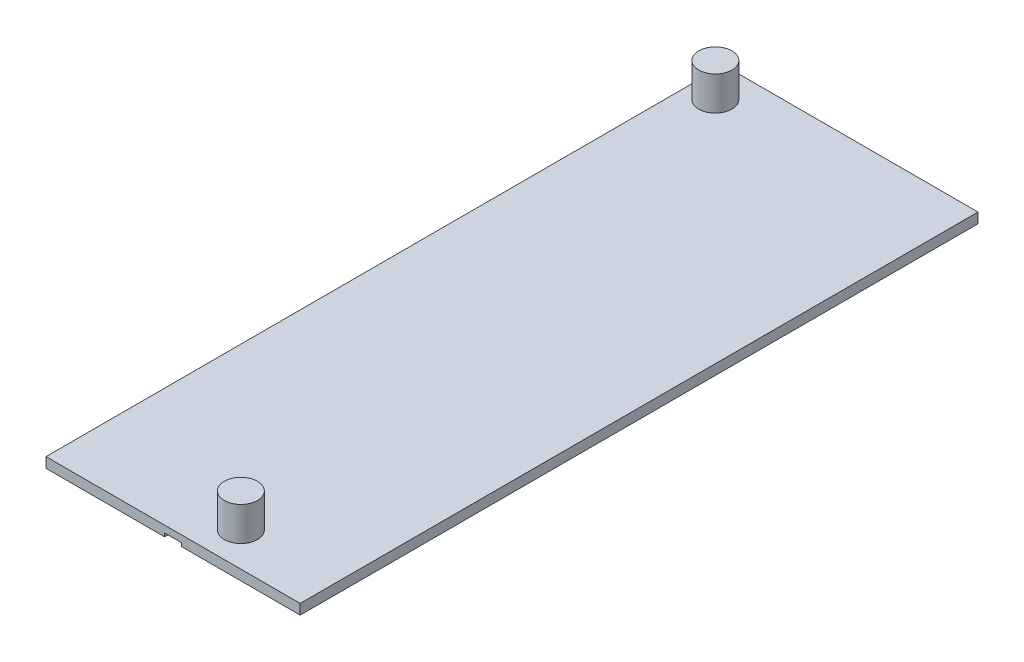
ISO-10303-21;
HEADER;
FILE_DESCRIPTION(('STEP AP214'),'2;1');
FILE_NAME('part.step','',(''),(''),'','','');
FILE_SCHEMA(('AUTOMOTIVE_DESIGN { 1 0 10303 214 1 1 1 1 }'));
ENDSEC;
DATA;
#1=APPLICATION_CONTEXT('core data for automotive mechanical design processes');
#2=APPLICATION_PROTOCOL_DEFINITION('international standard','automotive_design',2000,#1);
#3=PRODUCT_CONTEXT('',#1,'mechanical');
#4=PRODUCT('Part','Part','',(#3));
#5=PRODUCT_RELATED_PRODUCT_CATEGORY('part','',(#4));
#6=PRODUCT_DEFINITION_FORMATION('','',#4);
#7=PRODUCT_DEFINITION_CONTEXT('part definition',#1,'design');
#8=PRODUCT_DEFINITION('design','',#6,#7);
#9=PRODUCT_DEFINITION_SHAPE('','',#8);
#10=(LENGTH_UNIT() NAMED_UNIT(*) SI_UNIT(.MILLI.,.METRE.));
#11=(NAMED_UNIT(*) PLANE_ANGLE_UNIT() SI_UNIT($,.RADIAN.));
#12=(NAMED_UNIT(*) SI_UNIT($,.STERADIAN.) SOLID_ANGLE_UNIT());
#13=UNCERTAINTY_MEASURE_WITH_UNIT(LENGTH_MEASURE(1.E-05),#10,'distance_accuracy_value','');
#14=(GEOMETRIC_REPRESENTATION_CONTEXT(3) GLOBAL_UNCERTAINTY_ASSIGNED_CONTEXT((#13)) GLOBAL_UNIT_ASSIGNED_CONTEXT((#10,
#11,#12)) REPRESENTATION_CONTEXT('',''));
#15=CARTESIAN_POINT('',(0.,0.,0.));
#16=DIRECTION('',(0.,0.,1.));
#17=DIRECTION('',(1.,0.,0.));
#18=AXIS2_PLACEMENT_3D('',#15,#16,#17);
#19=CARTESIAN_POINT('',(0.,0.,200.));
#20=DIRECTION('',(0.,1.,0.));
#21=DIRECTION('',(0.,0.,1.));
#22=AXIS2_PLACEMENT_3D('',#19,#20,#21);
#23=PLANE('',#22);
#24=DIRECTION('',(1.,0.,0.));
#25=VECTOR('',#24,1.);
#26=CARTESIAN_POINT('',(0.,0.,0.));
#27=LINE('',#26,#25);
#28=CARTESIAN_POINT('',(0.,0.,0.));
#29=VERTEX_POINT('',#28);
#30=CARTESIAN_POINT('',(35.,0.,0.));
#31=VERTEX_POINT('',#30);
#32=EDGE_CURVE('E156',#29,#31,#27,.T.);
#33=ORIENTED_EDGE('',*,*,#32,.T.);
#34=DIRECTION('',(0.,0.,-1.));
#35=VECTOR('',#34,1.);
#36=CARTESIAN_POINT('',(35.,0.,200.));
#37=LINE('',#36,#35);
#38=CARTESIAN_POINT('',(35.,0.,200.));
#39=VERTEX_POINT('',#38);
#40=EDGE_CURVE('E207',#39,#31,#37,.T.);
#41=ORIENTED_EDGE('',*,*,#40,.F.);
#42=DIRECTION('',(1.,0.,0.));
#43=VECTOR('',#42,1.);
#44=CARTESIAN_POINT('',(0.,0.,200.));
#45=LINE('',#44,#43);
#46=CARTESIAN_POINT('',(0.,0.,200.));
#47=VERTEX_POINT('',#46);
#48=EDGE_CURVE('E89',#47,#39,#45,.T.);
#49=ORIENTED_EDGE('',*,*,#48,.F.);
#50=DIRECTION('',(0.,0.,-1.));
#51=VECTOR('',#50,1.);
#52=CARTESIAN_POINT('',(0.,0.,200.));
#53=LINE('',#52,#51);
#54=EDGE_CURVE('E168',#47,#29,#53,.T.);
#55=ORIENTED_EDGE('',*,*,#54,.T.);
#56=EDGE_LOOP('',(#33,#41,#49,#55));
#57=FACE_BOUND('',#56,.T.);
#58=ADVANCED_FACE('F36',(#57),#23,.F.);
#59=CARTESIAN_POINT('',(0.,0.,200.));
#60=DIRECTION('',(1.,0.,0.));
#61=DIRECTION('',(0.,0.,-1.));
#62=AXIS2_PLACEMENT_3D('',#59,#60,#61);
#63=PLANE('',#62);
#64=DIRECTION('',(0.,-1.,0.));
#65=VECTOR('',#64,1.);
#66=CARTESIAN_POINT('',(0.,0.,0.));
#67=LINE('',#66,#65);
#68=CARTESIAN_POINT('',(0.,3.,0.));
#69=VERTEX_POINT('',#68);
#70=EDGE_CURVE('E145',#69,#29,#67,.T.);
#71=ORIENTED_EDGE('',*,*,#70,.T.);
#72=ORIENTED_EDGE('',*,*,#54,.F.);
#73=DIRECTION('',(0.,-1.,0.));
#74=VECTOR('',#73,1.);
#75=CARTESIAN_POINT('',(0.,0.,200.));
#76=LINE('',#75,#74);
#77=CARTESIAN_POINT('',(0.,3.,200.));
#78=VERTEX_POINT('',#77);
#79=EDGE_CURVE('E146',#78,#47,#76,.T.);
#80=ORIENTED_EDGE('',*,*,#79,.F.);
#81=DIRECTION('',(0.,0.,-1.));
#82=VECTOR('',#81,1.);
#83=CARTESIAN_POINT('',(0.,3.,200.));
#84=LINE('',#83,#82);
#85=EDGE_CURVE('E153',#78,#69,#84,.T.);
#86=ORIENTED_EDGE('',*,*,#85,.T.);
#87=EDGE_LOOP('',(#71,#72,#80,#86));
#88=FACE_BOUND('',#87,.T.);
#89=ADVANCED_FACE('F38',(#88),#63,.F.);
#90=CARTESIAN_POINT('',(40.,0.,200.));
#91=VERTEX_POINT('',#90);
#92=CARTESIAN_POINT('',(75.,0.,200.));
#93=VERTEX_POINT('',#92);
#94=EDGE_CURVE('E148',#91,#93,#45,.T.);
#95=ORIENTED_EDGE('',*,*,#94,.F.);
#96=DIRECTION('',(0.,0.,1.));
#97=VECTOR('',#96,1.);
#98=CARTESIAN_POINT('',(40.,0.,200.));
#99=LINE('',#98,#97);
#100=CARTESIAN_POINT('',(40.0000000000001,0.,0.));
#101=VERTEX_POINT('',#100);
#102=EDGE_CURVE('E201',#101,#91,#99,.T.);
#103=ORIENTED_EDGE('',*,*,#102,.F.);
#104=CARTESIAN_POINT('',(75.,0.,0.));
#105=VERTEX_POINT('',#104);
#106=EDGE_CURVE('E131',#101,#105,#27,.T.);
#107=ORIENTED_EDGE('',*,*,#106,.T.);
#108=DIRECTION('',(0.,0.,-1.));
#109=VECTOR('',#108,1.);
#110=CARTESIAN_POINT('',(75.,0.,200.));
#111=LINE('',#110,#109);
#112=EDGE_CURVE('E165',#93,#105,#111,.T.);
#113=ORIENTED_EDGE('',*,*,#112,.F.);
#114=EDGE_LOOP('',(#95,#103,#107,#113));
#115=FACE_BOUND('',#114,.T.);
#116=ADVANCED_FACE('F185',(#115),#23,.F.);
#117=CARTESIAN_POINT('',(75.,0.,200.));
#118=DIRECTION('',(-1.,0.,0.));
#119=DIRECTION('',(0.,0.,1.));
#120=AXIS2_PLACEMENT_3D('',#117,#118,#119);
#121=PLANE('',#120);
#122=DIRECTION('',(0.,1.,0.));
#123=VECTOR('',#122,1.);
#124=CARTESIAN_POINT('',(75.,0.,0.));
#125=LINE('',#124,#123);
#126=CARTESIAN_POINT('',(75.,3.,0.));
#127=VERTEX_POINT('',#126);
#128=EDGE_CURVE('E159',#105,#127,#125,.T.);
#129=ORIENTED_EDGE('',*,*,#128,.T.);
#130=DIRECTION('',(0.,0.,-1.));
#131=VECTOR('',#130,1.);
#132=CARTESIAN_POINT('',(75.,3.,200.));
#133=LINE('',#132,#131);
#134=CARTESIAN_POINT('',(75.,3.,200.));
#135=VERTEX_POINT('',#134);
#136=EDGE_CURVE('E163',#135,#127,#133,.T.);
#137=ORIENTED_EDGE('',*,*,#136,.F.);
#138=DIRECTION('',(0.,1.,0.));
#139=VECTOR('',#138,1.);
#140=CARTESIAN_POINT('',(75.,0.,200.));
#141=LINE('',#140,#139);
#142=EDGE_CURVE('E150',#93,#135,#141,.T.);
#143=ORIENTED_EDGE('',*,*,#142,.F.);
#144=ORIENTED_EDGE('',*,*,#112,.T.);
#145=EDGE_LOOP('',(#129,#137,#143,#144));
#146=FACE_BOUND('',#145,.T.);
#147=ADVANCED_FACE('F177',(#146),#121,.F.);
#148=CARTESIAN_POINT('',(0.,3.,200.));
#149=DIRECTION('',(0.,-1.,0.));
#150=DIRECTION('',(0.,0.,-1.));
#151=AXIS2_PLACEMENT_3D('',#148,#149,#150);
#152=PLANE('',#151);
#153=CARTESIAN_POINT('',(47.5,3.,190.));
#154=DIRECTION('',(0.,-1.,0.));
#155=DIRECTION('',(0.,0.,-1.));
#156=AXIS2_PLACEMENT_3D('',#153,#154,#155);
#157=CIRCLE('',#156,4.9);
#158=CARTESIAN_POINT('',(47.5,3.,185.1));
#159=VERTEX_POINT('',#158);
#160=EDGE_CURVE('E11',#159,#159,#157,.F.);
#161=ORIENTED_EDGE('',*,*,#160,.F.);
#162=EDGE_LOOP('',(#161));
#163=FACE_BOUND('',#162,.T.);
#164=CARTESIAN_POINT('',(7.49999999999997,3.,10.));
#165=DIRECTION('',(0.,-1.,0.));
#166=DIRECTION('',(0.,0.,-1.));
#167=AXIS2_PLACEMENT_3D('',#164,#165,#166);
#168=CIRCLE('',#167,4.9);
#169=CARTESIAN_POINT('',(7.49999999999997,3.,5.10000000000001));
#170=VERTEX_POINT('',#169);
#171=EDGE_CURVE('E44',#170,#170,#168,.F.);
#172=ORIENTED_EDGE('',*,*,#171,.F.);
#173=EDGE_LOOP('',(#172));
#174=FACE_BOUND('',#173,.T.);
#175=DIRECTION('',(-1.,0.,0.));
#176=VECTOR('',#175,1.);
#177=CARTESIAN_POINT('',(0.,3.,0.));
#178=LINE('',#177,#176);
#179=EDGE_CURVE('E81',#127,#69,#178,.T.);
#180=ORIENTED_EDGE('',*,*,#179,.T.);
#181=ORIENTED_EDGE('',*,*,#85,.F.);
#182=DIRECTION('',(-1.,0.,0.));
#183=VECTOR('',#182,1.);
#184=CARTESIAN_POINT('',(0.,3.,200.));
#185=LINE('',#184,#183);
#186=EDGE_CURVE('E60',#135,#78,#185,.T.);
#187=ORIENTED_EDGE('',*,*,#186,.F.);
#188=ORIENTED_EDGE('',*,*,#136,.T.);
#189=EDGE_LOOP('',(#180,#181,#187,#188));
#190=FACE_BOUND('',#189,.T.);
#191=ADVANCED_FACE('F174',(#163,#174,#190),#152,.F.);
#192=CARTESIAN_POINT('',(0.,0.,200.));
#193=DIRECTION('',(0.,0.,-1.));
#194=DIRECTION('',(-1.,0.,0.));
#195=AXIS2_PLACEMENT_3D('',#192,#193,#194);
#196=PLANE('',#195);
#197=ORIENTED_EDGE('',*,*,#48,.T.);
#198=DIRECTION('',(0.,-1.,0.));
#199=VECTOR('',#198,1.);
#200=CARTESIAN_POINT('',(35.,1.,200.));
#201=LINE('',#200,#199);
#202=CARTESIAN_POINT('',(35.,1.,200.));
#203=VERTEX_POINT('',#202);
#204=EDGE_CURVE('E134',#203,#39,#201,.T.);
#205=ORIENTED_EDGE('',*,*,#204,.F.);
#206=DIRECTION('',(-1.,0.,0.));
#207=VECTOR('',#206,1.);
#208=CARTESIAN_POINT('',(35.,1.,200.));
#209=LINE('',#208,#207);
#210=CARTESIAN_POINT('',(40.,1.,200.));
#211=VERTEX_POINT('',#210);
#212=EDGE_CURVE('E120',#211,#203,#209,.T.);
#213=ORIENTED_EDGE('',*,*,#212,.F.);
#214=DIRECTION('',(0.,-1.,0.));
#215=VECTOR('',#214,1.);
#216=CARTESIAN_POINT('',(40.,1.,200.));
#217=LINE('',#216,#215);
#218=EDGE_CURVE('E118',#211,#91,#217,.T.);
#219=ORIENTED_EDGE('',*,*,#218,.T.);
#220=ORIENTED_EDGE('',*,*,#94,.T.);
#221=ORIENTED_EDGE('',*,*,#142,.T.);
#222=ORIENTED_EDGE('',*,*,#186,.T.);
#223=ORIENTED_EDGE('',*,*,#79,.T.);
#224=EDGE_LOOP('',(#197,#205,#213,#219,#220,#221,#222,#223));
#225=FACE_BOUND('',#224,.T.);
#226=ADVANCED_FACE('F176',(#225),#196,.F.);
#227=CARTESIAN_POINT('',(0.,0.,0.));
#228=DIRECTION('',(0.,0.,-1.));
#229=DIRECTION('',(-1.,0.,0.));
#230=AXIS2_PLACEMENT_3D('',#227,#228,#229);
#231=PLANE('',#230);
#232=DIRECTION('',(0.,-1.,0.));
#233=VECTOR('',#232,1.);
#234=CARTESIAN_POINT('',(35.,1.,0.));
#235=LINE('',#234,#233);
#236=CARTESIAN_POINT('',(35.,1.,0.));
#237=VERTEX_POINT('',#236);
#238=EDGE_CURVE('E132',#237,#31,#235,.T.);
#239=ORIENTED_EDGE('',*,*,#238,.T.);
#240=ORIENTED_EDGE('',*,*,#32,.F.);
#241=ORIENTED_EDGE('',*,*,#70,.F.);
#242=ORIENTED_EDGE('',*,*,#179,.F.);
#243=ORIENTED_EDGE('',*,*,#128,.F.);
#244=ORIENTED_EDGE('',*,*,#106,.F.);
#245=DIRECTION('',(0.,-1.,0.));
#246=VECTOR('',#245,1.);
#247=CARTESIAN_POINT('',(40.0000000000001,1.,0.));
#248=LINE('',#247,#246);
#249=CARTESIAN_POINT('',(40.0000000000001,1.,0.));
#250=VERTEX_POINT('',#249);
#251=EDGE_CURVE('E115',#250,#101,#248,.T.);
#252=ORIENTED_EDGE('',*,*,#251,.F.);
#253=DIRECTION('',(1.,0.,0.));
#254=VECTOR('',#253,1.);
#255=CARTESIAN_POINT('',(35.,1.,0.));
#256=LINE('',#255,#254);
#257=EDGE_CURVE('E121',#237,#250,#256,.T.);
#258=ORIENTED_EDGE('',*,*,#257,.F.);
#259=EDGE_LOOP('',(#239,#240,#241,#242,#243,#244,#252,#258));
#260=FACE_BOUND('',#259,.T.);
#261=ADVANCED_FACE('F129',(#260),#231,.T.);
#262=CARTESIAN_POINT('',(7.49999999999997,13.,10.));
#263=DIRECTION('',(0.,-1.,0.));
#264=DIRECTION('',(0.,0.,-1.));
#265=AXIS2_PLACEMENT_3D('',#262,#263,#264);
#266=CYLINDRICAL_SURFACE('',#265,4.9);
#267=CARTESIAN_POINT('',(7.49999999999997,13.,10.));
#268=DIRECTION('',(0.,1.,0.));
#269=DIRECTION('',(0.,0.,1.));
#270=AXIS2_PLACEMENT_3D('',#267,#268,#269);
#271=CIRCLE('',#270,4.9);
#272=CARTESIAN_POINT('',(7.49999999999997,13.,14.9));
#273=VERTEX_POINT('',#272);
#274=EDGE_CURVE('E142',#273,#273,#271,.T.);
#275=ORIENTED_EDGE('',*,*,#274,.F.);
#276=EDGE_LOOP('',(#275));
#277=FACE_BOUND('',#276,.T.);
#278=ORIENTED_EDGE('',*,*,#171,.T.);
#279=EDGE_LOOP('',(#278));
#280=FACE_BOUND('',#279,.T.);
#281=ADVANCED_FACE('F172',(#277,#280),#266,.T.);
#282=CARTESIAN_POINT('',(0.,13.,0.));
#283=DIRECTION('',(0.,1.,0.));
#284=DIRECTION('',(0.,0.,1.));
#285=AXIS2_PLACEMENT_3D('',#282,#283,#284);
#286=PLANE('',#285);
#287=ORIENTED_EDGE('',*,*,#274,.T.);
#288=EDGE_LOOP('',(#287));
#289=FACE_BOUND('',#288,.T.);
#290=ADVANCED_FACE('F229',(#289),#286,.T.);
#291=CARTESIAN_POINT('',(47.5,13.,190.));
#292=DIRECTION('',(0.,-1.,0.));
#293=DIRECTION('',(0.,0.,-1.));
#294=AXIS2_PLACEMENT_3D('',#291,#292,#293);
#295=CYLINDRICAL_SURFACE('',#294,4.9);
#296=CARTESIAN_POINT('',(47.5,13.,190.));
#297=DIRECTION('',(0.,1.,0.));
#298=DIRECTION('',(0.,0.,1.));
#299=AXIS2_PLACEMENT_3D('',#296,#297,#298);
#300=CIRCLE('',#299,4.9);
#301=CARTESIAN_POINT('',(47.5,13.,194.9));
#302=VERTEX_POINT('',#301);
#303=EDGE_CURVE('E139',#302,#302,#300,.T.);
#304=ORIENTED_EDGE('',*,*,#303,.F.);
#305=EDGE_LOOP('',(#304));
#306=FACE_BOUND('',#305,.T.);
#307=ORIENTED_EDGE('',*,*,#160,.T.);
#308=EDGE_LOOP('',(#307));
#309=FACE_BOUND('',#308,.T.);
#310=ADVANCED_FACE('F223',(#306,#309),#295,.T.);
#311=CARTESIAN_POINT('',(47.5,13.,190.));
#312=DIRECTION('',(0.,1.,0.));
#313=DIRECTION('',(0.,0.,1.));
#314=AXIS2_PLACEMENT_3D('',#311,#312,#313);
#315=PLANE('',#314);
#316=ORIENTED_EDGE('',*,*,#303,.T.);
#317=EDGE_LOOP('',(#316));
#318=FACE_BOUND('',#317,.T.);
#319=ADVANCED_FACE('F216',(#318),#315,.T.);
#320=CARTESIAN_POINT('',(35.,1.,200.));
#321=DIRECTION('',(-1.,0.,0.));
#322=DIRECTION('',(0.,0.,1.));
#323=AXIS2_PLACEMENT_3D('',#320,#321,#322);
#324=PLANE('',#323);
#325=ORIENTED_EDGE('',*,*,#40,.T.);
#326=ORIENTED_EDGE('',*,*,#238,.F.);
#327=DIRECTION('',(0.,0.,-1.));
#328=VECTOR('',#327,1.);
#329=CARTESIAN_POINT('',(35.,1.,200.));
#330=LINE('',#329,#328);
#331=EDGE_CURVE('E51',#203,#237,#330,.T.);
#332=ORIENTED_EDGE('',*,*,#331,.F.);
#333=ORIENTED_EDGE('',*,*,#204,.T.);
#334=EDGE_LOOP('',(#325,#326,#332,#333));
#335=FACE_BOUND('',#334,.T.);
#336=ADVANCED_FACE('F210',(#335),#324,.F.);
#337=CARTESIAN_POINT('',(40.,1.,200.));
#338=DIRECTION('',(1.,0.,0.));
#339=DIRECTION('',(0.,0.,-1.));
#340=AXIS2_PLACEMENT_3D('',#337,#338,#339);
#341=PLANE('',#340);
#342=ORIENTED_EDGE('',*,*,#102,.T.);
#343=ORIENTED_EDGE('',*,*,#218,.F.);
#344=DIRECTION('',(0.,0.,1.));
#345=VECTOR('',#344,1.);
#346=CARTESIAN_POINT('',(40.,1.,200.));
#347=LINE('',#346,#345);
#348=EDGE_CURVE('E112',#250,#211,#347,.T.);
#349=ORIENTED_EDGE('',*,*,#348,.F.);
#350=ORIENTED_EDGE('',*,*,#251,.T.);
#351=EDGE_LOOP('',(#342,#343,#349,#350));
#352=FACE_BOUND('',#351,.T.);
#353=ADVANCED_FACE('F113',(#352),#341,.F.);
#354=CARTESIAN_POINT('',(0.,1.,0.));
#355=DIRECTION('',(0.,-1.,0.));
#356=DIRECTION('',(0.,0.,-1.));
#357=AXIS2_PLACEMENT_3D('',#354,#355,#356);
#358=PLANE('',#357);
#359=ORIENTED_EDGE('',*,*,#331,.T.);
#360=ORIENTED_EDGE('',*,*,#257,.T.);
#361=ORIENTED_EDGE('',*,*,#348,.T.);
#362=ORIENTED_EDGE('',*,*,#212,.T.);
#363=EDGE_LOOP('',(#359,#360,#361,#362));
#364=FACE_BOUND('',#363,.T.);
#365=ADVANCED_FACE('F124',(#364),#358,.T.);
#366=CLOSED_SHELL('',(#58,#89,#116,#147,#191,#226,#261,#281,#290,#310,#319,#336,#353,#365));
#367=MANIFOLD_SOLID_BREP('B2',#366);
#368=ADVANCED_BREP_SHAPE_REPRESENTATION('',(#18,#367),#14);
#369=SHAPE_DEFINITION_REPRESENTATION(#9,#368);
ENDSEC;
END-ISO-10303-21;
